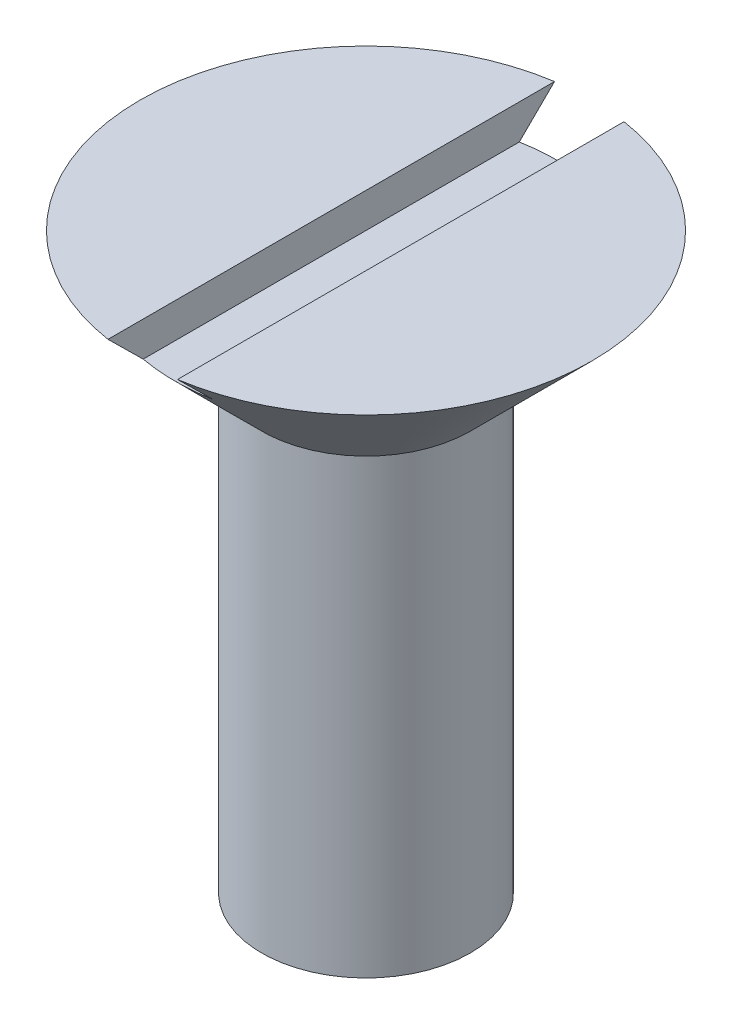
ISO-10303-21;
HEADER;
FILE_DESCRIPTION(('STEP AP214'),'2;1');
FILE_NAME('part.step','',(''),(''),'','','');
FILE_SCHEMA(('AUTOMOTIVE_DESIGN { 1 0 10303 214 1 1 1 1 }'));
ENDSEC;
DATA;
#1=APPLICATION_CONTEXT('core data for automotive mechanical design processes');
#2=APPLICATION_PROTOCOL_DEFINITION('international standard','automotive_design',2000,#1);
#3=PRODUCT_CONTEXT('',#1,'mechanical');
#4=PRODUCT('Part','Part','',(#3));
#5=PRODUCT_RELATED_PRODUCT_CATEGORY('part','',(#4));
#6=PRODUCT_DEFINITION_FORMATION('','',#4);
#7=PRODUCT_DEFINITION_CONTEXT('part definition',#1,'design');
#8=PRODUCT_DEFINITION('design','',#6,#7);
#9=PRODUCT_DEFINITION_SHAPE('','',#8);
#10=(LENGTH_UNIT() NAMED_UNIT(*) SI_UNIT(.MILLI.,.METRE.));
#11=(NAMED_UNIT(*) PLANE_ANGLE_UNIT() SI_UNIT($,.RADIAN.));
#12=(NAMED_UNIT(*) SI_UNIT($,.STERADIAN.) SOLID_ANGLE_UNIT());
#13=UNCERTAINTY_MEASURE_WITH_UNIT(LENGTH_MEASURE(1.E-05),#10,'distance_accuracy_value','');
#14=(GEOMETRIC_REPRESENTATION_CONTEXT(3) GLOBAL_UNCERTAINTY_ASSIGNED_CONTEXT((#13)) GLOBAL_UNIT_ASSIGNED_CONTEXT((#10,
#11,#12)) REPRESENTATION_CONTEXT('',''));
#15=CARTESIAN_POINT('',(0.,0.,0.));
#16=DIRECTION('',(0.,0.,1.));
#17=DIRECTION('',(1.,0.,0.));
#18=AXIS2_PLACEMENT_3D('',#15,#16,#17);
#19=CARTESIAN_POINT('',(0.,-3.49999999999999,0.));
#20=DIRECTION('',(0.,1.,0.));
#21=DIRECTION('',(-1.,0.,0.));
#22=AXIS2_PLACEMENT_3D('',#19,#20,#21);
#23=CONICAL_SURFACE('',#22,3.00000000000003,0.785398163397444);
#24=CARTESIAN_POINT('',(0.,-3.49999999999999,0.));
#25=DIRECTION('',(0.,1.,0.));
#26=DIRECTION('',(-1.,0.,0.));
#27=AXIS2_PLACEMENT_3D('',#24,#25,#26);
#28=CIRCLE('',#27,3.00000000000003);
#29=CARTESIAN_POINT('',(-3.00000000000003,-3.49999999999999,0.));
#30=VERTEX_POINT('',#29);
#31=EDGE_CURVE('E144',#30,#30,#28,.T.);
#32=ORIENTED_EDGE('',*,*,#31,.T.);
#33=EDGE_LOOP('',(#32));
#34=FACE_BOUND('',#33,.T.);
#35=CARTESIAN_POINT('',(1.,0.000699999999998145,-6.42332472244709));
#36=CARTESIAN_POINT('',(1.,-0.183792492730859,-6.23660097945427));
#37=CARTESIAN_POINT('',(1.,-0.368197265502149,-6.04979042026791));
#38=CARTESIAN_POINT('',(1.,-0.736867330263016,-5.67580075194415));
#39=CARTESIAN_POINT('',(1.,-0.92113246232217,-5.48862148517341));
#40=CARTESIAN_POINT('',(1.,-1.29147888472824,-5.11174427199789));
#41=CARTESIAN_POINT('',(1.,-1.47755623700704,-4.92204245247594));
#42=CARTESIAN_POINT('',(1.,-1.84910847038618,-4.54228085926047));
#43=CARTESIAN_POINT('',(1.,-2.03458365424802,-4.35222138163071));
#44=CARTESIAN_POINT('',(1.,-2.47967422686256,-3.89448779308014));
#45=CARTESIAN_POINT('',(1.,-2.73895793178235,-3.62648996292632));
#46=CARTESIAN_POINT('',(1.,-3.12625588297494,-3.22235847326328));
#47=CARTESIAN_POINT('',(1.,-3.25522556988709,-3.08714155543485));
#48=CARTESIAN_POINT('',(1.,-3.5121835062283,-2.81583986260069));
#49=CARTESIAN_POINT('',(1.,-3.64017198670763,-2.67975530664803));
#50=CARTESIAN_POINT('',(1.,-3.89354332458538,-2.40750996464745));
#51=CARTESIAN_POINT('',(1.,-4.01893932812048,-2.27136147506035));
#52=CARTESIAN_POINT('',(1.,-4.20534855331889,-2.06549251852145));
#53=CARTESIAN_POINT('',(1.,-4.26723322358794,-1.99656195550249));
#54=CARTESIAN_POINT('',(1.,-4.39022064724425,-1.85800765522079));
#55=CARTESIAN_POINT('',(1.,-4.4513234170242,-1.78838393254487));
#56=CARTESIAN_POINT('',(1.,-4.57222497841278,-1.64849944827692));
#57=CARTESIAN_POINT('',(1.,-4.63202802495721,-1.57824237330108));
#58=CARTESIAN_POINT('',(1.,-4.75014951544361,-1.43649465507046));
#59=CARTESIAN_POINT('',(1.,-4.80846810173443,-1.36500413120585));
#60=CARTESIAN_POINT('',(1.,-4.92284314732723,-1.22040224759315));
#61=CARTESIAN_POINT('',(1.,-4.97890283473653,-1.14729345020525));
#62=CARTESIAN_POINT('',(1.,-5.08766859703451,-0.998633654183121));
#63=CARTESIAN_POINT('',(1.,-5.14037670023424,-0.923084175167192));
#64=CARTESIAN_POINT('',(1.,-5.20258630848191,-0.826733268002404));
#65=CARTESIAN_POINT('',(1.,-5.21469371972441,-0.807613449628525));
#66=CARTESIAN_POINT('',(1.,-5.23852006929557,-0.769130032509422));
#67=CARTESIAN_POINT('',(1.,-5.2502389573782,-0.749766402676452));
#68=CARTESIAN_POINT('',(1.,-5.2847341306278,-0.691277443855452));
#69=CARTESIAN_POINT('',(1.,-5.30684764106781,-0.65175601211042));
#70=CARTESIAN_POINT('',(1.,-5.34856731254032,-0.571795836460231));
#71=CARTESIAN_POINT('',(1.,-5.36819205120949,-0.531366913059427));
#72=CARTESIAN_POINT('',(1.,-5.40437851230792,-0.44916452711807));
#73=CARTESIAN_POINT('',(1.,-5.42094116313474,-0.407391476629318));
#74=CARTESIAN_POINT('',(1.,-5.45547408789911,-0.30663033961619));
#75=CARTESIAN_POINT('',(1.,-5.47168567336591,-0.247006700383596));
#76=CARTESIAN_POINT('',(1.,-5.49382871149306,-0.125997310764462));
#77=CARTESIAN_POINT('',(1.,-5.49979783689234,-0.0646188656950381));
#78=CARTESIAN_POINT('',(1.,-5.50019251863303,0.0584045004398335));
#79=CARTESIAN_POINT('',(1.,-5.4945759121545,0.12004957722218));
#80=CARTESIAN_POINT('',(1.,-5.47299050567838,0.241594604406575));
#81=CARTESIAN_POINT('',(1.,-5.45698650773002,0.301487895031276));
#82=CARTESIAN_POINT('',(1.,-5.41575455607624,0.423255248595584));
#83=CARTESIAN_POINT('',(1.,-5.389891379238,0.484904761598871));
#84=CARTESIAN_POINT('',(1.,-5.33222056445681,0.605404375291071));
#85=CARTESIAN_POINT('',(1.,-5.3004015313472,0.664248833759898));
#86=CARTESIAN_POINT('',(1.,-5.23260105967629,0.78007672237702));
#87=CARTESIAN_POINT('',(1.,-5.19658863752792,0.837041711978548));
#88=CARTESIAN_POINT('',(1.,-5.14058479415503,0.921108655798587));
#89=CARTESIAN_POINT('',(1.,-5.12159440728007,0.948889451470504));
#90=CARTESIAN_POINT('',(1.,-5.08305169452404,1.0040579150845));
#91=CARTESIAN_POINT('',(1.,-5.06349938486038,1.031445594338));
#92=CARTESIAN_POINT('',(1.,-5.00047703669955,1.11814350022161));
#93=CARTESIAN_POINT('',(1.,-4.95612701181294,1.17681365371045));
#94=CARTESIAN_POINT('',(1.,-4.86586836876557,1.2929461238685));
#95=CARTESIAN_POINT('',(1.,-4.81995950984237,1.35040825171822));
#96=CARTESIAN_POINT('',(1.,-4.6805230557243,1.5214838603525));
#97=CARTESIAN_POINT('',(1.,-4.58532582897306,1.63373305297746));
#98=CARTESIAN_POINT('',(1.,-4.39226012979686,1.85622604953611));
#99=CARTESIAN_POINT('',(1.,-4.294387276121,1.9664660022124));
#100=CARTESIAN_POINT('',(1.,-4.09707443457573,2.18547633450558));
#101=CARTESIAN_POINT('',(1.,-3.99763489283887,2.2942471166665));
#102=CARTESIAN_POINT('',(1.,-3.7980314999237,2.51044729255297));
#103=CARTESIAN_POINT('',(1.,-3.69787117348213,2.61787995144465));
#104=CARTESIAN_POINT('',(1.,-3.4968028801798,2.83205668510748));
#105=CARTESIAN_POINT('',(1.,-3.3958948614808,2.93880071115691));
#106=CARTESIAN_POINT('',(1.,-3.09256905568919,3.258073482484));
#107=CARTESIAN_POINT('',(1.,-2.88935836112706,3.46984818145683));
#108=CARTESIAN_POINT('',(1.,-2.46344877975671,3.91117980862642));
#109=CARTESIAN_POINT('',(1.,-2.24063709954972,4.14062755160484));
#110=CARTESIAN_POINT('',(1.,-1.79406507282812,4.59874114188853));
#111=CARTESIAN_POINT('',(1.,-1.57030444459726,4.82740671438614));
#112=CARTESIAN_POINT('',(1.,-1.12218852408603,5.28420548161038));
#113=CARTESIAN_POINT('',(1.,-0.897833166436137,5.51233861215151));
#114=CARTESIAN_POINT('',(1.,-0.448792076408278,5.96812929258621));
#115=CARTESIAN_POINT('',(1.,-0.224106479587287,6.19578697599763));
#116=CARTESIAN_POINT('',(1.,0.000699999999997177,6.42332472244709));
#117=B_SPLINE_CURVE_WITH_KNOTS('',3,(#35,#36,#37,#38,#39,#40,#41,#42,#43,#44,#45,#46,#47,#48,
#49,#50,#51,#52,#53,#54,#55,#56,#57,#58,#59,#60,#61,#62,#63,#64,#65,#66,#67,#68,#69,#70,#71,#72,
#73,#74,#75,#76,#77,#78,#79,#80,#81,#82,#83,#84,#85,#86,#87,#88,#89,#90,#91,#92,#93,#94,#95,#96,
#97,#98,#99,#100,#101,#102,#103,#104,#105,#106,#107,#108,#109,#110,#111,#112,#113,#114,#115,
#116),.UNSPECIFIED.,.F.,.F.,(4,2,2,2,2,2,2,2,2,2,2,2,2,2,2,2,2,2,2,2,2,2,2,2,2,2,2,2,2,2,2,2,2,
2,2,2,2,2,2,2,4),(0.,0.787482879091093,1.57545946982074,2.37264371237519,3.16933207457063,
4.28800672997834,4.84858456810998,5.40902607813937,5.96429483881584,6.24219393443102,
6.5200871942613,6.79686319025392,7.07361254470395,7.34995126360953,7.62612112424392,
7.69400967717525,7.76190697586421,7.89770861286134,8.03242799072325,8.16710645565281,
8.35176568840788,8.53574425942206,8.72039354672402,8.90567181282055,9.10576489619663,
9.30624479924504,9.50831322811275,9.60926230610501,9.71020847356944,9.93080591781795,
10.1514375897977,10.5929016423221,11.0351379005563,11.4772504248659,11.9178874921871,
12.3585554006095,13.239049802286,14.198537310266,15.1583329960948,16.1182389566303,
17.0778239415921),.UNSPECIFIED.);
#118=CARTESIAN_POINT('',(1.,0.,-6.42261628933256));
#119=VERTEX_POINT('',#118);
#120=CARTESIAN_POINT('',(1.,-1.,-5.40832691319599));
#121=VERTEX_POINT('',#120);
#122=EDGE_CURVE('E102',#119,#121,#117,.T.);
#123=ORIENTED_EDGE('',*,*,#122,.F.);
#124=CARTESIAN_POINT('',(0.,0.,0.));
#125=DIRECTION('',(0.,1.,0.));
#126=DIRECTION('',(-1.,0.,0.));
#127=AXIS2_PLACEMENT_3D('',#124,#125,#126);
#128=CIRCLE('',#127,6.5);
#129=CARTESIAN_POINT('',(1.,0.,6.42261628933256));
#130=VERTEX_POINT('',#129);
#131=EDGE_CURVE('E147',#130,#119,#128,.T.);
#132=ORIENTED_EDGE('',*,*,#131,.F.);
#133=CARTESIAN_POINT('',(1.,-1.,5.40832691319599));
#134=VERTEX_POINT('',#133);
#135=EDGE_CURVE('E98',#134,#130,#117,.T.);
#136=ORIENTED_EDGE('',*,*,#135,.F.);
#137=CARTESIAN_POINT('',(0.,-1.,0.));
#138=DIRECTION('',(0.,-1.,0.));
#139=DIRECTION('',(0.,0.,-1.));
#140=AXIS2_PLACEMENT_3D('',#137,#138,#139);
#141=CIRCLE('',#140,5.50000000000001);
#142=CARTESIAN_POINT('',(-1.,-1.,5.40832691319599));
#143=VERTEX_POINT('',#142);
#144=EDGE_CURVE('E43',#134,#143,#141,.T.);
#145=ORIENTED_EDGE('',*,*,#144,.T.);
#146=CARTESIAN_POINT('',(-1.,0.000699999999998145,-6.42332472244709));
#147=CARTESIAN_POINT('',(-1.,-0.183792492730859,-6.23660097945427));
#148=CARTESIAN_POINT('',(-1.,-0.368197265502147,-6.04979042026791));
#149=CARTESIAN_POINT('',(-1.,-0.736867330263014,-5.67580075194415));
#150=CARTESIAN_POINT('',(-1.,-0.921132462322168,-5.48862148517341));
#151=CARTESIAN_POINT('',(-1.,-1.29147888472823,-5.11174427199789));
#152=CARTESIAN_POINT('',(-1.,-1.47755623700704,-4.92204245247595));
#153=CARTESIAN_POINT('',(-1.,-1.84910847038618,-4.54228085926048));
#154=CARTESIAN_POINT('',(-1.,-2.03458365424801,-4.35222138163071));
#155=CARTESIAN_POINT('',(-1.,-2.47967422686255,-3.89448779308014));
#156=CARTESIAN_POINT('',(-1.,-2.73895793178234,-3.62648996292633));
#157=CARTESIAN_POINT('',(-1.,-3.12625588297493,-3.22235847326329));
#158=CARTESIAN_POINT('',(-1.,-3.25522556988708,-3.08714155543485));
#159=CARTESIAN_POINT('',(-1.,-3.51218350622829,-2.8158398626007));
#160=CARTESIAN_POINT('',(-1.,-3.64017198670762,-2.67975530664804));
#161=CARTESIAN_POINT('',(-1.,-3.89354332458538,-2.40750996464745));
#162=CARTESIAN_POINT('',(-1.,-4.01893932812048,-2.27136147506036));
#163=CARTESIAN_POINT('',(-1.,-4.20534855331888,-2.06549251852145));
#164=CARTESIAN_POINT('',(-1.,-4.26723322358794,-1.99656195550249));
#165=CARTESIAN_POINT('',(-1.,-4.39022064724425,-1.85800765522079));
#166=CARTESIAN_POINT('',(-1.,-4.4513234170242,-1.78838393254487));
#167=CARTESIAN_POINT('',(-1.,-4.57222497841277,-1.64849944827693));
#168=CARTESIAN_POINT('',(-1.,-4.6320280249572,-1.57824237330108));
#169=CARTESIAN_POINT('',(-1.,-4.75014951544361,-1.43649465507046));
#170=CARTESIAN_POINT('',(-1.,-4.80846810173443,-1.36500413120585));
#171=CARTESIAN_POINT('',(-1.,-4.92284314732723,-1.22040224759315));
#172=CARTESIAN_POINT('',(-1.,-4.97890283473653,-1.14729345020525));
#173=CARTESIAN_POINT('',(-1.,-5.08766859703451,-0.998633654183123));
#174=CARTESIAN_POINT('',(-1.,-5.14037670023424,-0.923084175167194));
#175=CARTESIAN_POINT('',(-1.,-5.20258630848191,-0.826733268002406));
#176=CARTESIAN_POINT('',(-1.,-5.21469371972441,-0.807613449628527));
#177=CARTESIAN_POINT('',(-1.,-5.23852006929557,-0.769130032509425));
#178=CARTESIAN_POINT('',(-1.,-5.2502389573782,-0.749766402676454));
#179=CARTESIAN_POINT('',(-1.,-5.2847341306278,-0.691277443855454));
#180=CARTESIAN_POINT('',(-1.,-5.30684764106781,-0.651756012110423));
#181=CARTESIAN_POINT('',(-1.,-5.34856731254032,-0.571795836460233));
#182=CARTESIAN_POINT('',(-1.,-5.36819205120949,-0.531366913059429));
#183=CARTESIAN_POINT('',(-1.,-5.40437851230792,-0.449164527118071));
#184=CARTESIAN_POINT('',(-1.,-5.42094116313474,-0.407391476629319));
#185=CARTESIAN_POINT('',(-1.,-5.45547408789911,-0.306630339616191));
#186=CARTESIAN_POINT('',(-1.,-5.47168567336591,-0.247006700383597));
#187=CARTESIAN_POINT('',(-1.,-5.49382871149306,-0.125997310764462));
#188=CARTESIAN_POINT('',(-1.,-5.49979783689234,-0.0646188656950384));
#189=CARTESIAN_POINT('',(-1.,-5.50019251863303,0.0584045004398332));
#190=CARTESIAN_POINT('',(-1.,-5.4945759121545,0.12004957722218));
#191=CARTESIAN_POINT('',(-1.,-5.47299050567838,0.241594604406575));
#192=CARTESIAN_POINT('',(-1.,-5.45698650773002,0.301487895031275));
#193=CARTESIAN_POINT('',(-1.,-5.41575455607624,0.423255248595585));
#194=CARTESIAN_POINT('',(-1.,-5.389891379238,0.484904761598872));
#195=CARTESIAN_POINT('',(-1.,-5.33222056445681,0.605404375291072));
#196=CARTESIAN_POINT('',(-1.,-5.3004015313472,0.664248833759898));
#197=CARTESIAN_POINT('',(-1.,-5.23260105967629,0.780076722377019));
#198=CARTESIAN_POINT('',(-1.,-5.19658863752793,0.837041711978547));
#199=CARTESIAN_POINT('',(-1.,-5.14058479415503,0.921108655798586));
#200=CARTESIAN_POINT('',(-1.,-5.12159440728007,0.948889451470504));
#201=CARTESIAN_POINT('',(-1.,-5.08305169452404,1.0040579150845));
#202=CARTESIAN_POINT('',(-1.,-5.06349938486038,1.031445594338));
#203=CARTESIAN_POINT('',(-1.,-5.00047703669955,1.11814350022161));
#204=CARTESIAN_POINT('',(-1.,-4.95612701181294,1.17681365371045));
#205=CARTESIAN_POINT('',(-1.,-4.86586836876557,1.2929461238685));
#206=CARTESIAN_POINT('',(-1.,-4.81995950984237,1.35040825171822));
#207=CARTESIAN_POINT('',(-1.,-4.6805230557243,1.5214838603525));
#208=CARTESIAN_POINT('',(-1.,-4.58532582897306,1.63373305297746));
#209=CARTESIAN_POINT('',(-1.,-4.39226012979686,1.85622604953611));
#210=CARTESIAN_POINT('',(-1.,-4.294387276121,1.9664660022124));
#211=CARTESIAN_POINT('',(-1.,-4.09707443457573,2.18547633450557));
#212=CARTESIAN_POINT('',(-1.,-3.99763489283888,2.2942471166665));
#213=CARTESIAN_POINT('',(-1.,-3.7980314999237,2.51044729255297));
#214=CARTESIAN_POINT('',(-1.,-3.69787117348214,2.61787995144465));
#215=CARTESIAN_POINT('',(-1.,-3.4968028801798,2.83205668510748));
#216=CARTESIAN_POINT('',(-1.,-3.39589486148081,2.9388007111569));
#217=CARTESIAN_POINT('',(-1.,-3.0925690556892,3.258073482484));
#218=CARTESIAN_POINT('',(-1.,-2.88935836112706,3.46984818145683));
#219=CARTESIAN_POINT('',(-1.,-2.46344877975672,3.91117980862642));
#220=CARTESIAN_POINT('',(-1.,-2.24063709954972,4.14062755160484));
#221=CARTESIAN_POINT('',(-1.,-1.79406507282812,4.59874114188852));
#222=CARTESIAN_POINT('',(-1.,-1.57030444459726,4.82740671438614));
#223=CARTESIAN_POINT('',(-1.,-1.12218852408603,5.28420548161038));
#224=CARTESIAN_POINT('',(-1.,-0.897833166436137,5.51233861215151));
#225=CARTESIAN_POINT('',(-1.,-0.448792076408277,5.96812929258622));
#226=CARTESIAN_POINT('',(-1.,-0.224106479587286,6.19578697599763));
#227=CARTESIAN_POINT('',(-1.,0.000699999999998359,6.42332472244709));
#228=B_SPLINE_CURVE_WITH_KNOTS('',3,(#146,#147,#148,#149,#150,#151,#152,#153,#154,#155,#156,
#157,#158,#159,#160,#161,#162,#163,#164,#165,#166,#167,#168,#169,#170,#171,#172,#173,#174,#175,
#176,#177,#178,#179,#180,#181,#182,#183,#184,#185,#186,#187,#188,#189,#190,#191,#192,#193,#194,
#195,#196,#197,#198,#199,#200,#201,#202,#203,#204,#205,#206,#207,#208,#209,#210,#211,#212,#213,
#214,#215,#216,#217,#218,#219,#220,#221,#222,#223,#224,#225,#226,#227),.UNSPECIFIED.,.F.,.F.,(4,
2,2,2,2,2,2,2,2,2,2,2,2,2,2,2,2,2,2,2,2,2,2,2,2,2,2,2,2,2,2,2,2,2,2,2,2,2,2,2,4),(0.,
0.787482879091092,1.57545946982074,2.37264371237518,3.16933207457063,4.28800672997833,
4.84858456810997,5.40902607813937,5.96429483881584,6.24219393443102,6.5200871942613,
6.79686319025392,7.07361254470395,7.34995126360953,7.62612112424392,7.69400967717525,
7.76190697586421,7.89770861286133,8.03242799072324,8.16710645565281,8.35176568840788,
8.53574425942206,8.72039354672403,8.90567181282055,9.10576489619663,9.30624479924504,
9.50831322811275,9.60926230610501,9.71020847356944,9.93080591781795,10.1514375897977,
10.5929016423221,11.0351379005563,11.4772504248659,11.9178874921871,12.3585554006095,
13.239049802286,14.198537310266,15.1583329960948,16.1182389566304,17.0778239415921),.UNSPECIFIED.);
#229=CARTESIAN_POINT('',(-1.,0.,6.42261628933256));
#230=VERTEX_POINT('',#229);
#231=EDGE_CURVE('E91',#143,#230,#228,.T.);
#232=ORIENTED_EDGE('',*,*,#231,.T.);
#233=CARTESIAN_POINT('',(-1.,0.,-6.42261628933256));
#234=VERTEX_POINT('',#233);
#235=EDGE_CURVE('E96',#234,#230,#128,.T.);
#236=ORIENTED_EDGE('',*,*,#235,.F.);
#237=CARTESIAN_POINT('',(-1.,-1.,-5.40832691319599));
#238=VERTEX_POINT('',#237);
#239=EDGE_CURVE('E55',#234,#238,#228,.T.);
#240=ORIENTED_EDGE('',*,*,#239,.T.);
#241=EDGE_CURVE('E11',#238,#121,#141,.T.);
#242=ORIENTED_EDGE('',*,*,#241,.T.);
#243=EDGE_LOOP('',(#123,#132,#136,#145,#232,#236,#240,#242));
#244=FACE_BOUND('',#243,.T.);
#245=ADVANCED_FACE('F39',(#34,#244),#23,.T.);
#246=CARTESIAN_POINT('',(0.,0.,0.));
#247=DIRECTION('',(0.,-1.,0.));
#248=DIRECTION('',(1.,0.,0.));
#249=AXIS2_PLACEMENT_3D('',#246,#247,#248);
#250=PLANE('',#249);
#251=DIRECTION('',(0.,0.,-1.));
#252=VECTOR('',#251,1.);
#253=CARTESIAN_POINT('',(1.,0.,0.));
#254=LINE('',#253,#252);
#255=EDGE_CURVE('E157',#130,#119,#254,.T.);
#256=ORIENTED_EDGE('',*,*,#255,.F.);
#257=ORIENTED_EDGE('',*,*,#131,.T.);
#258=EDGE_LOOP('',(#256,#257));
#259=FACE_BOUND('',#258,.T.);
#260=ADVANCED_FACE('F131',(#259),#250,.F.);
#261=CARTESIAN_POINT('',(0.,-18.2320508075689,0.));
#262=DIRECTION('',(0.,1.,0.));
#263=DIRECTION('',(-1.,0.,0.));
#264=AXIS2_PLACEMENT_3D('',#261,#262,#263);
#265=CONICAL_SURFACE('',#264,0.,1.04719755119659);
#266=CARTESIAN_POINT('',(0.,-16.5,0.));
#267=DIRECTION('',(0.,1.,0.));
#268=DIRECTION('',(-1.,0.,0.));
#269=AXIS2_PLACEMENT_3D('',#266,#267,#268);
#270=CIRCLE('',#269,3.);
#271=CARTESIAN_POINT('',(-3.,-16.5,0.));
#272=VERTEX_POINT('',#271);
#273=EDGE_CURVE('E146',#272,#272,#270,.T.);
#274=ORIENTED_EDGE('',*,*,#273,.F.);
#275=EDGE_LOOP('',(#274));
#276=FACE_BOUND('',#275,.T.);
#277=CARTESIAN_POINT('',(0.,-18.2320508075689,0.));
#278=VERTEX_POINT('',#277);
#279=VERTEX_LOOP('',#278);
#280=FACE_BOUND('',#279,.T.);
#281=ADVANCED_FACE('F41',(#276,#280),#265,.T.);
#282=CARTESIAN_POINT('',(0.,0.,0.));
#283=DIRECTION('',(0.,1.,0.));
#284=DIRECTION('',(-1.,0.,0.));
#285=AXIS2_PLACEMENT_3D('',#282,#283,#284);
#286=CYLINDRICAL_SURFACE('',#285,3.00000000000002);
#287=ORIENTED_EDGE('',*,*,#31,.F.);
#288=EDGE_LOOP('',(#287));
#289=FACE_BOUND('',#288,.T.);
#290=ORIENTED_EDGE('',*,*,#273,.T.);
#291=EDGE_LOOP('',(#290));
#292=FACE_BOUND('',#291,.T.);
#293=ADVANCED_FACE('F129',(#289,#292),#286,.T.);
#294=ORIENTED_EDGE('',*,*,#235,.T.);
#295=DIRECTION('',(0.,0.,-1.));
#296=VECTOR('',#295,1.);
#297=CARTESIAN_POINT('',(-1.,0.,0.));
#298=LINE('',#297,#296);
#299=EDGE_CURVE('E152',#230,#234,#298,.T.);
#300=ORIENTED_EDGE('',*,*,#299,.T.);
#301=EDGE_LOOP('',(#294,#300));
#302=FACE_BOUND('',#301,.T.);
#303=ADVANCED_FACE('F124',(#302),#250,.F.);
#304=CARTESIAN_POINT('',(-1.,-1.,-43.));
#305=DIRECTION('',(0.,-1.,0.));
#306=DIRECTION('',(0.,0.,-1.));
#307=AXIS2_PLACEMENT_3D('',#304,#305,#306);
#308=PLANE('',#307);
#309=DIRECTION('',(0.,0.,1.));
#310=VECTOR('',#309,1.);
#311=CARTESIAN_POINT('',(1.,-1.,-43.));
#312=LINE('',#311,#310);
#313=EDGE_CURVE('E86',#121,#134,#312,.T.);
#314=ORIENTED_EDGE('',*,*,#313,.F.);
#315=ORIENTED_EDGE('',*,*,#241,.F.);
#316=DIRECTION('',(0.,0.,1.));
#317=VECTOR('',#316,1.);
#318=CARTESIAN_POINT('',(-1.,-1.,-43.));
#319=LINE('',#318,#317);
#320=EDGE_CURVE('E83',#238,#143,#319,.T.);
#321=ORIENTED_EDGE('',*,*,#320,.T.);
#322=ORIENTED_EDGE('',*,*,#144,.F.);
#323=EDGE_LOOP('',(#314,#315,#321,#322));
#324=FACE_BOUND('',#323,.T.);
#325=ADVANCED_FACE('F82',(#324),#308,.F.);
#326=CARTESIAN_POINT('',(1.,1.,-43.));
#327=DIRECTION('',(-1.,0.,0.));
#328=DIRECTION('',(0.,-1.,0.));
#329=AXIS2_PLACEMENT_3D('',#326,#327,#328);
#330=PLANE('',#329);
#331=ORIENTED_EDGE('',*,*,#122,.T.);
#332=ORIENTED_EDGE('',*,*,#313,.T.);
#333=ORIENTED_EDGE('',*,*,#135,.T.);
#334=ORIENTED_EDGE('',*,*,#255,.T.);
#335=EDGE_LOOP('',(#331,#332,#333,#334));
#336=FACE_BOUND('',#335,.T.);
#337=ADVANCED_FACE('F122',(#336),#330,.T.);
#338=CARTESIAN_POINT('',(-0.999999999999999,1.,-43.));
#339=DIRECTION('',(-1.,0.,0.));
#340=DIRECTION('',(0.,-1.,0.));
#341=AXIS2_PLACEMENT_3D('',#338,#339,#340);
#342=PLANE('',#341);
#343=ORIENTED_EDGE('',*,*,#299,.F.);
#344=ORIENTED_EDGE('',*,*,#231,.F.);
#345=ORIENTED_EDGE('',*,*,#320,.F.);
#346=ORIENTED_EDGE('',*,*,#239,.F.);
#347=EDGE_LOOP('',(#343,#344,#345,#346));
#348=FACE_BOUND('',#347,.T.);
#349=ADVANCED_FACE('F89',(#348),#342,.F.);
#350=CLOSED_SHELL('',(#245,#260,#281,#293,#303,#325,#337,#349));
#351=MANIFOLD_SOLID_BREP('B2',#350);
#352=ADVANCED_BREP_SHAPE_REPRESENTATION('',(#18,#351),#14);
#353=SHAPE_DEFINITION_REPRESENTATION(#9,#352);
ENDSEC;
END-ISO-10303-21;
